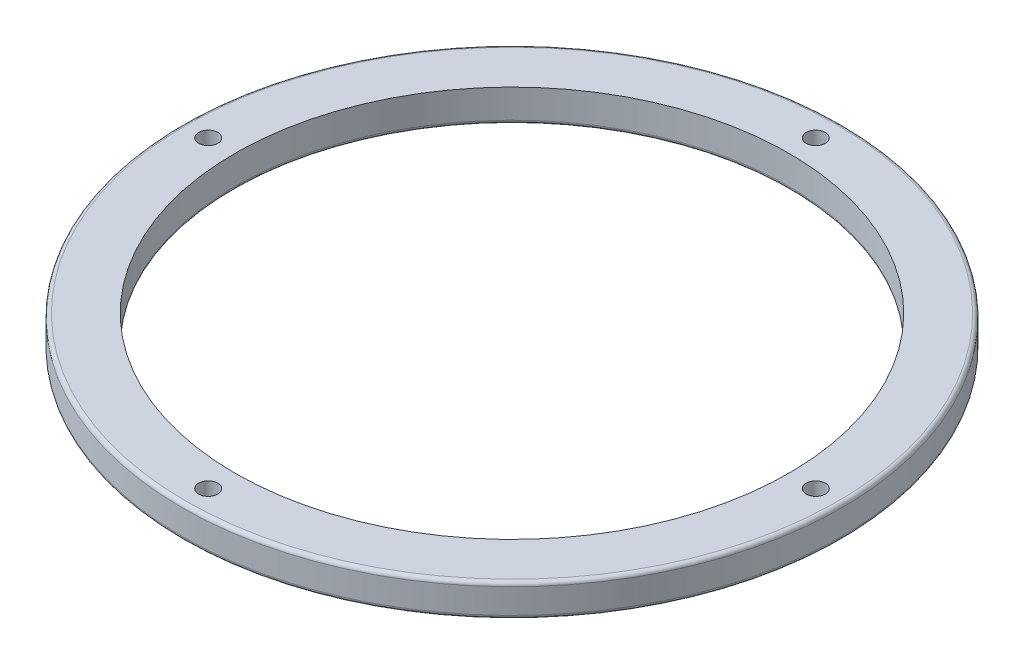
ISO-10303-21;
HEADER;
FILE_DESCRIPTION(('STEP AP214'),'2;1');
FILE_NAME('part.step','',(''),(''),'','','');
FILE_SCHEMA(('AUTOMOTIVE_DESIGN { 1 0 10303 214 1 1 1 1 }'));
ENDSEC;
DATA;
#1=APPLICATION_CONTEXT('core data for automotive mechanical design processes');
#2=APPLICATION_PROTOCOL_DEFINITION('international standard','automotive_design',2000,#1);
#3=PRODUCT_CONTEXT('',#1,'mechanical');
#4=PRODUCT('Part','Part','',(#3));
#5=PRODUCT_RELATED_PRODUCT_CATEGORY('part','',(#4));
#6=PRODUCT_DEFINITION_FORMATION('','',#4);
#7=PRODUCT_DEFINITION_CONTEXT('part definition',#1,'design');
#8=PRODUCT_DEFINITION('design','',#6,#7);
#9=PRODUCT_DEFINITION_SHAPE('','',#8);
#10=(LENGTH_UNIT() NAMED_UNIT(*) SI_UNIT(.MILLI.,.METRE.));
#11=(NAMED_UNIT(*) PLANE_ANGLE_UNIT() SI_UNIT($,.RADIAN.));
#12=(NAMED_UNIT(*) SI_UNIT($,.STERADIAN.) SOLID_ANGLE_UNIT());
#13=UNCERTAINTY_MEASURE_WITH_UNIT(LENGTH_MEASURE(1.E-05),#10,'distance_accuracy_value','');
#14=(GEOMETRIC_REPRESENTATION_CONTEXT(3) GLOBAL_UNCERTAINTY_ASSIGNED_CONTEXT((#13)) GLOBAL_UNIT_ASSIGNED_CONTEXT((#10,
#11,#12)) REPRESENTATION_CONTEXT('',''));
#15=CARTESIAN_POINT('',(0.,0.,0.));
#16=DIRECTION('',(0.,0.,1.));
#17=DIRECTION('',(1.,0.,0.));
#18=AXIS2_PLACEMENT_3D('',#15,#16,#17);
#19=CARTESIAN_POINT('',(0.,8.5,0.));
#20=DIRECTION('',(0.,1.,0.));
#21=DIRECTION('',(0.,0.,1.));
#22=AXIS2_PLACEMENT_3D('',#19,#20,#21);
#23=PLANE('',#22);
#24=CARTESIAN_POINT('',(0.,8.5,-79.5));
#25=DIRECTION('',(0.,1.,0.));
#26=DIRECTION('',(0.,0.,1.));
#27=AXIS2_PLACEMENT_3D('',#24,#25,#26);
#28=CIRCLE('',#27,2.49999999999999);
#29=CARTESIAN_POINT('',(0.,8.5,-77.));
#30=VERTEX_POINT('',#29);
#31=EDGE_CURVE('E88',#30,#30,#28,.T.);
#32=ORIENTED_EDGE('',*,*,#31,.F.);
#33=EDGE_LOOP('',(#32));
#34=FACE_BOUND('',#33,.T.);
#35=CARTESIAN_POINT('',(79.5,8.5,0.));
#36=DIRECTION('',(0.,1.,0.));
#37=DIRECTION('',(0.,0.,1.));
#38=AXIS2_PLACEMENT_3D('',#35,#36,#37);
#39=CIRCLE('',#38,2.49999999999999);
#40=CARTESIAN_POINT('',(79.5,8.5,2.49999999999999));
#41=VERTEX_POINT('',#40);
#42=EDGE_CURVE('E82',#41,#41,#39,.T.);
#43=ORIENTED_EDGE('',*,*,#42,.F.);
#44=EDGE_LOOP('',(#43));
#45=FACE_BOUND('',#44,.T.);
#46=CARTESIAN_POINT('',(0.,8.5,79.5));
#47=DIRECTION('',(0.,1.,0.));
#48=DIRECTION('',(0.,0.,1.));
#49=AXIS2_PLACEMENT_3D('',#46,#47,#48);
#50=CIRCLE('',#49,2.49999999999999);
#51=CARTESIAN_POINT('',(0.,8.5,82.));
#52=VERTEX_POINT('',#51);
#53=EDGE_CURVE('E76',#52,#52,#50,.T.);
#54=ORIENTED_EDGE('',*,*,#53,.F.);
#55=EDGE_LOOP('',(#54));
#56=FACE_BOUND('',#55,.T.);
#57=CARTESIAN_POINT('',(-79.5,8.5,0.));
#58=DIRECTION('',(0.,1.,0.));
#59=DIRECTION('',(0.,0.,1.));
#60=AXIS2_PLACEMENT_3D('',#57,#58,#59);
#61=CIRCLE('',#60,2.49999999999999);
#62=CARTESIAN_POINT('',(-79.5,8.5,2.49999999999999));
#63=VERTEX_POINT('',#62);
#64=EDGE_CURVE('E70',#63,#63,#61,.T.);
#65=ORIENTED_EDGE('',*,*,#64,.F.);
#66=EDGE_LOOP('',(#65));
#67=FACE_BOUND('',#66,.T.);
#68=CARTESIAN_POINT('',(0.,8.5,0.));
#69=DIRECTION('',(0.,1.,0.));
#70=DIRECTION('',(0.,0.,1.));
#71=AXIS2_PLACEMENT_3D('',#68,#69,#70);
#72=CIRCLE('',#71,85.25);
#73=CARTESIAN_POINT('',(0.,8.5,85.25));
#74=VERTEX_POINT('',#73);
#75=EDGE_CURVE('E61',#74,#74,#72,.T.);
#76=ORIENTED_EDGE('',*,*,#75,.T.);
#77=EDGE_LOOP('',(#76));
#78=FACE_BOUND('',#77,.T.);
#79=CARTESIAN_POINT('',(0.,8.5,0.));
#80=DIRECTION('',(0.,1.,0.));
#81=DIRECTION('',(0.,0.,1.));
#82=AXIS2_PLACEMENT_3D('',#79,#80,#81);
#83=CIRCLE('',#82,72.5);
#84=CARTESIAN_POINT('',(0.,8.5,72.5));
#85=VERTEX_POINT('',#84);
#86=EDGE_CURVE('E64',#85,#85,#83,.T.);
#87=ORIENTED_EDGE('',*,*,#86,.F.);
#88=EDGE_LOOP('',(#87));
#89=FACE_BOUND('',#88,.T.);
#90=ADVANCED_FACE('F38',(#34,#45,#56,#67,#78,#89),#23,.T.);
#91=CARTESIAN_POINT('',(0.,0.,0.));
#92=DIRECTION('',(0.,1.,0.));
#93=DIRECTION('',(0.,0.,1.));
#94=AXIS2_PLACEMENT_3D('',#91,#92,#93);
#95=PLANE('',#94);
#96=CARTESIAN_POINT('',(0.,0.,-79.5));
#97=DIRECTION('',(0.,1.,0.));
#98=DIRECTION('',(0.,0.,1.));
#99=AXIS2_PLACEMENT_3D('',#96,#97,#98);
#100=CIRCLE('',#99,2.5);
#101=CARTESIAN_POINT('',(0.,0.,-77.));
#102=VERTEX_POINT('',#101);
#103=EDGE_CURVE('E85',#102,#102,#100,.T.);
#104=ORIENTED_EDGE('',*,*,#103,.T.);
#105=EDGE_LOOP('',(#104));
#106=FACE_BOUND('',#105,.T.);
#107=CARTESIAN_POINT('',(79.5,0.,0.));
#108=DIRECTION('',(0.,1.,0.));
#109=DIRECTION('',(0.,0.,1.));
#110=AXIS2_PLACEMENT_3D('',#107,#108,#109);
#111=CIRCLE('',#110,2.5);
#112=CARTESIAN_POINT('',(79.5,0.,2.5));
#113=VERTEX_POINT('',#112);
#114=EDGE_CURVE('E79',#113,#113,#111,.T.);
#115=ORIENTED_EDGE('',*,*,#114,.T.);
#116=EDGE_LOOP('',(#115));
#117=FACE_BOUND('',#116,.T.);
#118=CARTESIAN_POINT('',(0.,0.,79.5));
#119=DIRECTION('',(0.,1.,0.));
#120=DIRECTION('',(0.,0.,1.));
#121=AXIS2_PLACEMENT_3D('',#118,#119,#120);
#122=CIRCLE('',#121,2.5);
#123=CARTESIAN_POINT('',(0.,0.,82.));
#124=VERTEX_POINT('',#123);
#125=EDGE_CURVE('E73',#124,#124,#122,.T.);
#126=ORIENTED_EDGE('',*,*,#125,.T.);
#127=EDGE_LOOP('',(#126));
#128=FACE_BOUND('',#127,.T.);
#129=CARTESIAN_POINT('',(-79.5,0.,0.));
#130=DIRECTION('',(0.,1.,0.));
#131=DIRECTION('',(0.,0.,1.));
#132=AXIS2_PLACEMENT_3D('',#129,#130,#131);
#133=CIRCLE('',#132,2.5);
#134=CARTESIAN_POINT('',(-79.5,0.,2.5));
#135=VERTEX_POINT('',#134);
#136=EDGE_CURVE('E67',#135,#135,#133,.T.);
#137=ORIENTED_EDGE('',*,*,#136,.T.);
#138=EDGE_LOOP('',(#137));
#139=FACE_BOUND('',#138,.T.);
#140=CARTESIAN_POINT('',(0.,0.,0.));
#141=DIRECTION('',(0.,1.,0.));
#142=DIRECTION('',(0.,0.,1.));
#143=AXIS2_PLACEMENT_3D('',#140,#141,#142);
#144=CIRCLE('',#143,73.5);
#145=CARTESIAN_POINT('',(0.,0.,73.5));
#146=VERTEX_POINT('',#145);
#147=EDGE_CURVE('E45',#146,#146,#144,.T.);
#148=ORIENTED_EDGE('',*,*,#147,.T.);
#149=EDGE_LOOP('',(#148));
#150=FACE_BOUND('',#149,.T.);
#151=CARTESIAN_POINT('',(0.,0.,0.));
#152=DIRECTION('',(0.,1.,0.));
#153=DIRECTION('',(0.,0.,1.));
#154=AXIS2_PLACEMENT_3D('',#151,#152,#153);
#155=CIRCLE('',#154,85.25);
#156=CARTESIAN_POINT('',(0.,0.,85.25));
#157=VERTEX_POINT('',#156);
#158=EDGE_CURVE('E49',#157,#157,#155,.F.);
#159=ORIENTED_EDGE('',*,*,#158,.T.);
#160=EDGE_LOOP('',(#159));
#161=FACE_BOUND('',#160,.T.);
#162=ADVANCED_FACE('F96',(#106,#117,#128,#139,#150,#161),#95,.F.);
#163=CARTESIAN_POINT('',(0.,8.5,0.));
#164=DIRECTION('',(0.,-1.,0.));
#165=DIRECTION('',(0.,0.,-1.));
#166=AXIS2_PLACEMENT_3D('',#163,#164,#165);
#167=CYLINDRICAL_SURFACE('',#166,86.25);
#168=CARTESIAN_POINT('',(0.,7.5,0.));
#169=DIRECTION('',(0.,1.,0.));
#170=DIRECTION('',(0.,0.,1.));
#171=AXIS2_PLACEMENT_3D('',#168,#169,#170);
#172=CIRCLE('',#171,86.25);
#173=CARTESIAN_POINT('',(0.,7.5,86.25));
#174=VERTEX_POINT('',#173);
#175=EDGE_CURVE('E53',#174,#174,#172,.F.);
#176=ORIENTED_EDGE('',*,*,#175,.T.);
#177=EDGE_LOOP('',(#176));
#178=FACE_BOUND('',#177,.T.);
#179=CARTESIAN_POINT('',(0.,1.,0.));
#180=DIRECTION('',(0.,1.,0.));
#181=DIRECTION('',(0.,0.,1.));
#182=AXIS2_PLACEMENT_3D('',#179,#180,#181);
#183=CIRCLE('',#182,86.25);
#184=CARTESIAN_POINT('',(0.,1.,86.25));
#185=VERTEX_POINT('',#184);
#186=EDGE_CURVE('E58',#185,#185,#183,.T.);
#187=ORIENTED_EDGE('',*,*,#186,.T.);
#188=EDGE_LOOP('',(#187));
#189=FACE_BOUND('',#188,.T.);
#190=ADVANCED_FACE('F111',(#178,#189),#167,.T.);
#191=CARTESIAN_POINT('',(0.,8.5,0.));
#192=DIRECTION('',(0.,-1.,0.));
#193=DIRECTION('',(0.,0.,-1.));
#194=AXIS2_PLACEMENT_3D('',#191,#192,#193);
#195=CYLINDRICAL_SURFACE('',#194,72.5);
#196=CARTESIAN_POINT('',(0.,1.,0.));
#197=DIRECTION('',(0.,1.,0.));
#198=DIRECTION('',(0.,0.,1.));
#199=AXIS2_PLACEMENT_3D('',#196,#197,#198);
#200=CIRCLE('',#199,72.5);
#201=CARTESIAN_POINT('',(0.,1.,72.5));
#202=VERTEX_POINT('',#201);
#203=EDGE_CURVE('E10',#202,#202,#200,.F.);
#204=ORIENTED_EDGE('',*,*,#203,.T.);
#205=EDGE_LOOP('',(#204));
#206=FACE_BOUND('',#205,.T.);
#207=ORIENTED_EDGE('',*,*,#86,.T.);
#208=EDGE_LOOP('',(#207));
#209=FACE_BOUND('',#208,.T.);
#210=ADVANCED_FACE('F108',(#206,#209),#195,.F.);
#211=CARTESIAN_POINT('',(0.,7.5,0.));
#212=DIRECTION('',(0.,1.,0.));
#213=DIRECTION('',(0.,0.,1.));
#214=AXIS2_PLACEMENT_3D('',#211,#212,#213);
#215=TOROIDAL_SURFACE('',#214,85.25,1.);
#216=ORIENTED_EDGE('',*,*,#175,.F.);
#217=EDGE_LOOP('',(#216));
#218=FACE_BOUND('',#217,.T.);
#219=ORIENTED_EDGE('',*,*,#75,.F.);
#220=EDGE_LOOP('',(#219));
#221=FACE_BOUND('',#220,.T.);
#222=ADVANCED_FACE('F110',(#218,#221),#215,.T.);
#223=CARTESIAN_POINT('',(0.,1.,0.));
#224=DIRECTION('',(0.,1.,0.));
#225=DIRECTION('',(0.,0.,1.));
#226=AXIS2_PLACEMENT_3D('',#223,#224,#225);
#227=TOROIDAL_SURFACE('',#226,73.5,1.);
#228=ORIENTED_EDGE('',*,*,#203,.F.);
#229=EDGE_LOOP('',(#228));
#230=FACE_BOUND('',#229,.T.);
#231=ORIENTED_EDGE('',*,*,#147,.F.);
#232=EDGE_LOOP('',(#231));
#233=FACE_BOUND('',#232,.T.);
#234=ADVANCED_FACE('F117',(#230,#233),#227,.T.);
#235=CARTESIAN_POINT('',(0.,1.,0.));
#236=DIRECTION('',(0.,1.,0.));
#237=DIRECTION('',(0.,0.,1.));
#238=AXIS2_PLACEMENT_3D('',#235,#236,#237);
#239=TOROIDAL_SURFACE('',#238,85.25,1.);
#240=ORIENTED_EDGE('',*,*,#158,.F.);
#241=EDGE_LOOP('',(#240));
#242=FACE_BOUND('',#241,.T.);
#243=ORIENTED_EDGE('',*,*,#186,.F.);
#244=EDGE_LOOP('',(#243));
#245=FACE_BOUND('',#244,.T.);
#246=ADVANCED_FACE('F40',(#242,#245),#239,.T.);
#247=CARTESIAN_POINT('',(-79.5,8.5,0.));
#248=DIRECTION('',(0.,1.,0.));
#249=DIRECTION('',(0.,0.,1.));
#250=AXIS2_PLACEMENT_3D('',#247,#248,#249);
#251=CYLINDRICAL_SURFACE('',#250,2.5);
#252=ORIENTED_EDGE('',*,*,#136,.F.);
#253=EDGE_LOOP('',(#252));
#254=FACE_BOUND('',#253,.T.);
#255=ORIENTED_EDGE('',*,*,#64,.T.);
#256=EDGE_LOOP('',(#255));
#257=FACE_BOUND('',#256,.T.);
#258=ADVANCED_FACE('F123',(#254,#257),#251,.F.);
#259=CARTESIAN_POINT('',(0.,8.5,79.5));
#260=DIRECTION('',(0.,1.,0.));
#261=DIRECTION('',(0.,0.,1.));
#262=AXIS2_PLACEMENT_3D('',#259,#260,#261);
#263=CYLINDRICAL_SURFACE('',#262,2.49999999999999);
#264=ORIENTED_EDGE('',*,*,#125,.F.);
#265=EDGE_LOOP('',(#264));
#266=FACE_BOUND('',#265,.T.);
#267=ORIENTED_EDGE('',*,*,#53,.T.);
#268=EDGE_LOOP('',(#267));
#269=FACE_BOUND('',#268,.T.);
#270=ADVANCED_FACE('F138',(#266,#269),#263,.F.);
#271=CARTESIAN_POINT('',(79.5,8.5,0.));
#272=DIRECTION('',(0.,1.,0.));
#273=DIRECTION('',(0.,0.,1.));
#274=AXIS2_PLACEMENT_3D('',#271,#272,#273);
#275=CYLINDRICAL_SURFACE('',#274,2.5);
#276=ORIENTED_EDGE('',*,*,#114,.F.);
#277=EDGE_LOOP('',(#276));
#278=FACE_BOUND('',#277,.T.);
#279=ORIENTED_EDGE('',*,*,#42,.T.);
#280=EDGE_LOOP('',(#279));
#281=FACE_BOUND('',#280,.T.);
#282=ADVANCED_FACE('F148',(#278,#281),#275,.F.);
#283=CARTESIAN_POINT('',(0.,8.5,-79.5));
#284=DIRECTION('',(0.,1.,0.));
#285=DIRECTION('',(0.,0.,1.));
#286=AXIS2_PLACEMENT_3D('',#283,#284,#285);
#287=CYLINDRICAL_SURFACE('',#286,2.49999999999999);
#288=ORIENTED_EDGE('',*,*,#103,.F.);
#289=EDGE_LOOP('',(#288));
#290=FACE_BOUND('',#289,.T.);
#291=ORIENTED_EDGE('',*,*,#31,.T.);
#292=EDGE_LOOP('',(#291));
#293=FACE_BOUND('',#292,.T.);
#294=ADVANCED_FACE('F92',(#290,#293),#287,.F.);
#295=CLOSED_SHELL('',(#90,#162,#190,#210,#222,#234,#246,#258,#270,#282,#294));
#296=MANIFOLD_SOLID_BREP('B2',#295);
#297=ADVANCED_BREP_SHAPE_REPRESENTATION('',(#18,#296),#14);
#298=SHAPE_DEFINITION_REPRESENTATION(#9,#297);
ENDSEC;
END-ISO-10303-21;
